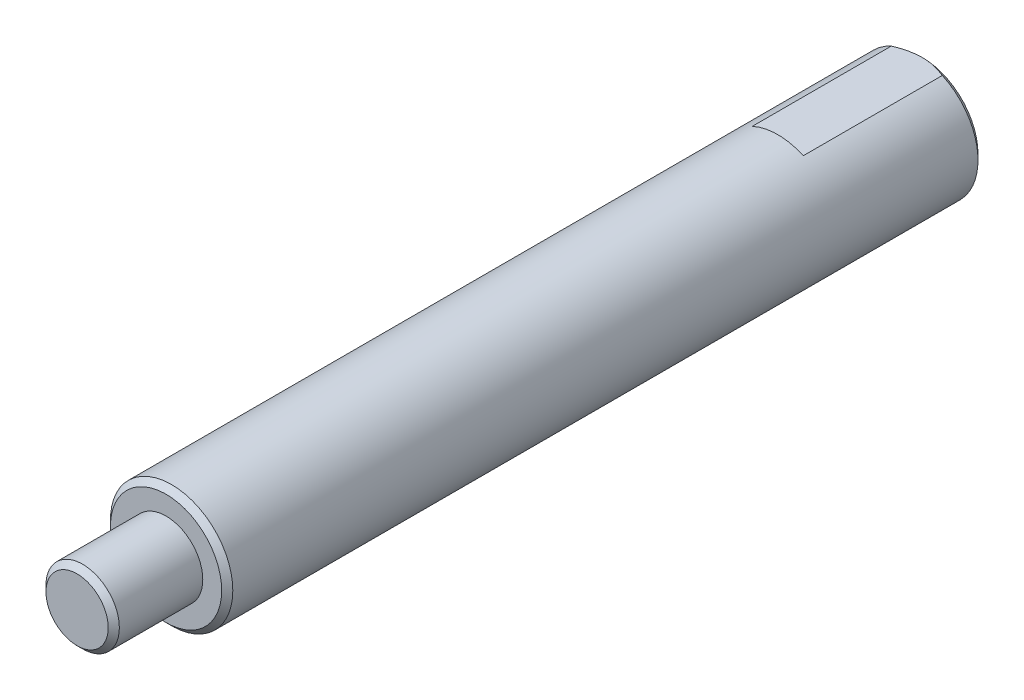
ISO-10303-21;
HEADER;
FILE_DESCRIPTION(('STEP AP214'),'2;1');
FILE_NAME('part.step','',(''),(''),'','','');
FILE_SCHEMA(('AUTOMOTIVE_DESIGN { 1 0 10303 214 1 1 1 1 }'));
ENDSEC;
DATA;
#1=APPLICATION_CONTEXT('core data for automotive mechanical design processes');
#2=APPLICATION_PROTOCOL_DEFINITION('international standard','automotive_design',2000,#1);
#3=PRODUCT_CONTEXT('',#1,'mechanical');
#4=PRODUCT('Part','Part','',(#3));
#5=PRODUCT_RELATED_PRODUCT_CATEGORY('part','',(#4));
#6=PRODUCT_DEFINITION_FORMATION('','',#4);
#7=PRODUCT_DEFINITION_CONTEXT('part definition',#1,'design');
#8=PRODUCT_DEFINITION('design','',#6,#7);
#9=PRODUCT_DEFINITION_SHAPE('','',#8);
#10=(LENGTH_UNIT() NAMED_UNIT(*) SI_UNIT(.MILLI.,.METRE.));
#11=(NAMED_UNIT(*) PLANE_ANGLE_UNIT() SI_UNIT($,.RADIAN.));
#12=(NAMED_UNIT(*) SI_UNIT($,.STERADIAN.) SOLID_ANGLE_UNIT());
#13=UNCERTAINTY_MEASURE_WITH_UNIT(LENGTH_MEASURE(1.E-05),#10,'distance_accuracy_value','');
#14=(GEOMETRIC_REPRESENTATION_CONTEXT(3) GLOBAL_UNCERTAINTY_ASSIGNED_CONTEXT((#13)) GLOBAL_UNIT_ASSIGNED_CONTEXT((#10,
#11,#12)) REPRESENTATION_CONTEXT('',''));
#15=CARTESIAN_POINT('',(0.,0.,0.));
#16=DIRECTION('',(0.,0.,1.));
#17=DIRECTION('',(1.,0.,0.));
#18=AXIS2_PLACEMENT_3D('',#15,#16,#17);
#19=CARTESIAN_POINT('',(0.,0.,0.5));
#20=DIRECTION('',(0.,0.,1.));
#21=DIRECTION('',(1.,0.,0.));
#22=AXIS2_PLACEMENT_3D('',#19,#20,#21);
#23=CONICAL_SURFACE('',#22,5.5,0.785398163397457);
#24=CARTESIAN_POINT('',(14.6848091307527,5.,10.5126921972504));
#25=CARTESIAN_POINT('',(14.4453208226169,5.,10.2859896541326));
#26=CARTESIAN_POINT('',(14.2055496886512,5.,10.0595855916861));
#27=CARTESIAN_POINT('',(13.7253433237667,5.,9.60748006149906));
#28=CARTESIAN_POINT('',(13.4849080888775,5.,9.38177859797622));
#29=CARTESIAN_POINT('',(12.7618962256916,5.,8.70536049882658));
#30=CARTESIAN_POINT('',(12.2781765081116,5.,8.25586410270802));
#31=CARTESIAN_POINT('',(11.285520275484,5.,7.34194274282295));
#32=CARTESIAN_POINT('',(10.7764003173808,5.,6.87771631839147));
#33=CARTESIAN_POINT('',(10.0081237078526,5.,6.18705169530893));
#34=CARTESIAN_POINT('',(9.75140731219676,5.,5.95789999795166));
#35=CARTESIAN_POINT('',(9.23598125315539,5.,5.50185127115898));
#36=CARTESIAN_POINT('',(8.97727160895973,5.,5.27495422006515));
#37=CARTESIAN_POINT('',(8.45777334373333,5.,4.82431921159364));
#38=CARTESIAN_POINT('',(8.19698831207968,5.,4.60057712329841));
#39=CARTESIAN_POINT('',(7.6723358301828,5.,4.15670009726197));
#40=CARTESIAN_POINT('',(7.4084682157494,5.,3.93656535317604));
#41=CARTESIAN_POINT('',(6.87588577364976,5.,3.50025684420232));
#42=CARTESIAN_POINT('',(6.60715699098736,5.,3.28410005066106));
#43=CARTESIAN_POINT('',(6.06467897085506,5.,2.85824880719012));
#44=CARTESIAN_POINT('',(5.79093054202075,5.,2.64855333071791));
#45=CARTESIAN_POINT('',(5.24247824545979,5.,2.24225256251792));
#46=CARTESIAN_POINT('',(4.96790940819435,5.,2.04546689887257));
#47=CARTESIAN_POINT('',(4.54965992503172,5.,1.7593740597509));
#48=CARTESIAN_POINT('',(4.40911425501469,5.,1.66548481679897));
#49=CARTESIAN_POINT('',(4.12560555295639,5.,1.48143277641831));
#50=CARTESIAN_POINT('',(3.98264266122826,5.,1.39126976373138));
#51=CARTESIAN_POINT('',(3.69483138879447,5.,1.21601413329321));
#52=CARTESIAN_POINT('',(3.54999993591857,5.,1.13089382459595));
#53=CARTESIAN_POINT('',(3.25720950323672,5.,0.96613475049896));
#54=CARTESIAN_POINT('',(3.10925012756169,5.,0.886496684424973));
#55=CARTESIAN_POINT('',(2.81011276522673,5.,0.734125373534712));
#56=CARTESIAN_POINT('',(2.65894061859038,5.,0.661380726321601));
#57=CARTESIAN_POINT('',(2.35286256329051,5.,0.524242686166179));
#58=CARTESIAN_POINT('',(2.19795788752428,5.,0.459846579258794));
#59=CARTESIAN_POINT('',(1.96757107505026,5.,0.372774300731281));
#60=CARTESIAN_POINT('',(1.89359074216658,5.,0.346101437024846));
#61=CARTESIAN_POINT('',(1.74478391072042,5.,0.295222264195086));
#62=CARTESIAN_POINT('',(1.66995737392907,5.,0.271016067006701));
#63=CARTESIAN_POINT('',(1.44419485912727,5.,0.202417832217193));
#64=CARTESIAN_POINT('',(1.29200049197909,5.,0.162055560028204));
#65=CARTESIAN_POINT('',(0.985646477349276,5.,0.0940487123556825));
#66=CARTESIAN_POINT('',(0.831502220582615,5.,0.0663354854095938));
#67=CARTESIAN_POINT('',(0.521341182896939,5.,0.0247588689838233));
#68=CARTESIAN_POINT('',(0.365324622092967,5.,0.0108938672889534));
#69=CARTESIAN_POINT('',(0.0516160098073081,5.,-0.00220571628048262));
#70=CARTESIAN_POINT('',(-0.106080254029489,5.,-0.00134130349865995));
#71=CARTESIAN_POINT('',(-0.420679844238093,5.,0.015205502727523));
#72=CARTESIAN_POINT('',(-0.577583163483296,5.,0.0308880291126693));
#73=CARTESIAN_POINT('',(-0.890071145811355,5.,0.0762385891218637));
#74=CARTESIAN_POINT('',(-1.04564624986807,5.,0.105971488681488));
#75=CARTESIAN_POINT('',(-1.35387421816574,5.,0.177884717281074));
#76=CARTESIAN_POINT('',(-1.50652647420601,5.,0.220067607636138));
#77=CARTESIAN_POINT('',(-1.89899228144063,5.,0.343556358459226));
#78=CARTESIAN_POINT('',(-2.13618939052799,5.,0.433155135839447));
#79=CARTESIAN_POINT('',(-2.6019239710927,5.,0.632544932175611));
#80=CARTESIAN_POINT('',(-2.83045405488705,5.,0.742352730382571));
#81=CARTESIAN_POINT('',(-3.16847602424751,5.,0.918609391765351));
#82=CARTESIAN_POINT('',(-3.2808721724946,5.,0.979600606049572));
#83=CARTESIAN_POINT('',(-3.50386518493618,5.,1.10479681410015));
#84=CARTESIAN_POINT('',(-3.61446202600304,5.,1.16900184913261));
#85=CARTESIAN_POINT('',(-3.83396126584146,5.,1.30012039469583));
#86=CARTESIAN_POINT('',(-3.94286443721393,5.,1.36703261693928));
#87=CARTESIAN_POINT('',(-4.15918024646913,5.,1.50320934076179));
#88=CARTESIAN_POINT('',(-4.26659294268127,5.,1.57247374992073));
#89=CARTESIAN_POINT('',(-4.62241235734337,5.,1.80671898738903));
#90=CARTESIAN_POINT('',(-4.8678658700884,5.,1.97619150842323));
#91=CARTESIAN_POINT('',(-5.35312692377588,5.,2.32306349681903));
#92=CARTESIAN_POINT('',(-5.5929332207239,5.,2.50046468625888));
#93=CARTESIAN_POINT('',(-6.06824445724728,5.,2.86127560728381));
#94=CARTESIAN_POINT('',(-6.30374612411163,5.,3.04468963665758));
#95=CARTESIAN_POINT('',(-6.77116765089348,5.,3.41597165684284));
#96=CARTESIAN_POINT('',(-7.00308779793956,5.,3.603839287518));
#97=CARTESIAN_POINT('',(-7.46479831203303,5.,3.98364854892032));
#98=CARTESIAN_POINT('',(-7.69457957218859,5.,4.17560122632358));
#99=CARTESIAN_POINT('',(-8.15180534086184,5.,4.56227258082269));
#100=CARTESIAN_POINT('',(-8.37924980937898,5.,4.7569913051315));
#101=CARTESIAN_POINT('',(-8.83212152767335,5.,5.14856830192789));
#102=CARTESIAN_POINT('',(-9.05754957794687,5.,5.34542564979244));
#103=CARTESIAN_POINT('',(-9.50680949169888,5.,5.74095449633208));
#104=CARTESIAN_POINT('',(-9.73064134364113,5.,5.93962600809511));
#105=CARTESIAN_POINT('',(-10.3554269609871,5.,6.49792304019967));
#106=CARTESIAN_POINT('',(-10.7548894567921,5.,6.85921712232008));
#107=CARTESIAN_POINT('',(-11.5506520435192,5.,7.58535654201278));
#108=CARTESIAN_POINT('',(-11.9469517546505,5.,7.95020229473568));
#109=CARTESIAN_POINT('',(-12.7346046209229,5.,8.6802168794551));
#110=CARTESIAN_POINT('',(-13.1259732089033,5.,9.04536907885113));
#111=CARTESIAN_POINT('',(-13.9067337252459,5.,9.77766414097997));
#112=CARTESIAN_POINT('',(-14.2961259422761,5.,10.1448066957958));
#113=CARTESIAN_POINT('',(-14.6848091307527,5.,10.5126921972504));
#114=B_SPLINE_CURVE_WITH_KNOTS('',3,(#24,#25,#26,#27,#28,#29,#30,#31,#32,#33,#34,#35,#36,#37,
#38,#39,#40,#41,#42,#43,#44,#45,#46,#47,#48,#49,#50,#51,#52,#53,#54,#55,#56,#57,#58,#59,#60,#61,
#62,#63,#64,#65,#66,#67,#68,#69,#70,#71,#72,#73,#74,#75,#76,#77,#78,#79,#80,#81,#82,#83,#84,#85,
#86,#87,#88,#89,#90,#91,#92,#93,#94,#95,#96,#97,#98,#99,#100,#101,#102,#103,#104,#105,#106,#107,
#108,#109,#110,#111,#112,#113),.UNSPECIFIED.,.F.,.F.,(4,2,2,2,2,2,2,2,2,2,2,2,2,2,2,2,2,2,2,2,2,
2,2,2,2,2,2,2,2,2,2,2,2,2,2,2,2,2,2,2,2,2,2,2,4),(0.,0.989311923310725,1.97862977419094,
3.95959337600449,6.02651317448664,7.05884240046679,8.09116170015323,9.12197286482435,
10.1528391870695,11.1873903696084,12.2217763312281,13.2349233326135,13.7419424161501,
14.2489321689687,14.7528143978999,15.2567607843972,15.7598584856993,16.2627922263957,
16.4986794127495,16.7345772986731,17.2064516788898,17.6757336299656,18.1449609407033,
18.6173431093421,19.0897295160002,19.5643184047905,20.0390049980712,20.798297788604,
21.5582238763949,21.9418160729224,22.325413196115,22.7088298733657,23.0922315031285,
23.9868071792125,24.8815781072262,25.7770031658052,26.6723560620085,27.5705534283766,
28.4687661443111,29.3666048627684,30.2644500636282,31.8802558929104,33.4962529155446,
35.1020309687601,36.707567313143),.UNSPECIFIED.);
#115=CARTESIAN_POINT('',(2.29128784747799,5.,0.499999999999981));
#116=VERTEX_POINT('',#115);
#117=CARTESIAN_POINT('',(0.,4.99999999999999,0.));
#118=VERTEX_POINT('',#117);
#119=EDGE_CURVE('E60',#116,#118,#114,.T.);
#120=ORIENTED_EDGE('',*,*,#119,.F.);
#121=CARTESIAN_POINT('',(0.,0.,0.5));
#122=DIRECTION('',(0.,0.,1.));
#123=DIRECTION('',(1.,0.,0.));
#124=AXIS2_PLACEMENT_3D('',#121,#122,#123);
#125=CIRCLE('',#124,5.5);
#126=CARTESIAN_POINT('',(2.29128784747792,-5.,0.5));
#127=VERTEX_POINT('',#126);
#128=EDGE_CURVE('E142',#127,#116,#125,.T.);
#129=ORIENTED_EDGE('',*,*,#128,.F.);
#130=CARTESIAN_POINT('',(-14.6848091307527,-5.,10.5126921972504));
#131=CARTESIAN_POINT('',(-14.4453208226169,-5.,10.2859896541325));
#132=CARTESIAN_POINT('',(-14.2055496886512,-5.,10.0595855916861));
#133=CARTESIAN_POINT('',(-13.7253433237667,-5.,9.60748006149906));
#134=CARTESIAN_POINT('',(-13.4849080888775,-5.,9.38177859797621));
#135=CARTESIAN_POINT('',(-12.7618962256916,-5.,8.70536049882658));
#136=CARTESIAN_POINT('',(-12.2781765081116,-5.,8.25586410270802));
#137=CARTESIAN_POINT('',(-11.285520275484,-5.,7.34194274282294));
#138=CARTESIAN_POINT('',(-10.7764003173808,-5.,6.87771631839147));
#139=CARTESIAN_POINT('',(-10.0081237078526,-5.,6.18705169530893));
#140=CARTESIAN_POINT('',(-9.75140731219676,-5.,5.95789999795166));
#141=CARTESIAN_POINT('',(-9.23598125315539,-5.,5.50185127115898));
#142=CARTESIAN_POINT('',(-8.97727160895972,-5.,5.27495422006515));
#143=CARTESIAN_POINT('',(-8.45777334373333,-5.,4.82431921159363));
#144=CARTESIAN_POINT('',(-8.19698831207968,-5.,4.60057712329841));
#145=CARTESIAN_POINT('',(-7.67233583018279,-5.,4.15670009726197));
#146=CARTESIAN_POINT('',(-7.4084682157494,-5.,3.93656535317604));
#147=CARTESIAN_POINT('',(-6.87588577364976,-5.,3.50025684420232));
#148=CARTESIAN_POINT('',(-6.60715699098736,-5.,3.28410005066106));
#149=CARTESIAN_POINT('',(-6.06467897085506,-5.,2.85824880719012));
#150=CARTESIAN_POINT('',(-5.79093054202075,-5.,2.64855333071791));
#151=CARTESIAN_POINT('',(-5.24247824545979,-5.,2.24225256251792));
#152=CARTESIAN_POINT('',(-4.96790940819436,-5.,2.04546689887257));
#153=CARTESIAN_POINT('',(-4.54965992503172,-5.,1.7593740597509));
#154=CARTESIAN_POINT('',(-4.40911425501469,-5.,1.66548481679897));
#155=CARTESIAN_POINT('',(-4.12560555295639,-5.,1.48143277641831));
#156=CARTESIAN_POINT('',(-3.98264266122826,-5.,1.39126976373138));
#157=CARTESIAN_POINT('',(-3.69483138879447,-5.,1.21601413329321));
#158=CARTESIAN_POINT('',(-3.54999993591857,-5.,1.13089382459595));
#159=CARTESIAN_POINT('',(-3.25720950323672,-5.,0.96613475049896));
#160=CARTESIAN_POINT('',(-3.10925012756169,-5.,0.886496684424973));
#161=CARTESIAN_POINT('',(-2.81011276522673,-5.,0.734125373534712));
#162=CARTESIAN_POINT('',(-2.65894061859038,-5.,0.661380726321601));
#163=CARTESIAN_POINT('',(-2.35286256329051,-5.,0.524242686166179));
#164=CARTESIAN_POINT('',(-2.19795788752428,-5.,0.459846579258795));
#165=CARTESIAN_POINT('',(-1.96757107505027,-5.,0.372774300731282));
#166=CARTESIAN_POINT('',(-1.89359074216658,-5.,0.346101437024846));
#167=CARTESIAN_POINT('',(-1.74478391072042,-5.,0.295222264195086));
#168=CARTESIAN_POINT('',(-1.66995737392907,-5.,0.271016067006701));
#169=CARTESIAN_POINT('',(-1.44419485912727,-5.,0.202417832217193));
#170=CARTESIAN_POINT('',(-1.29200049197909,-5.,0.162055560028204));
#171=CARTESIAN_POINT('',(-0.985646477349277,-5.,0.0940487123556828));
#172=CARTESIAN_POINT('',(-0.831502220582616,-5.,0.0663354854095948));
#173=CARTESIAN_POINT('',(-0.52134118289694,-5.,0.0247588689838242));
#174=CARTESIAN_POINT('',(-0.365324622092969,-5.,0.0108938672889537));
#175=CARTESIAN_POINT('',(-0.0516160098073107,-5.,-0.00220571628048288));
#176=CARTESIAN_POINT('',(0.106080254029486,-5.,-0.00134130349866004));
#177=CARTESIAN_POINT('',(0.42067984423809,-5.,0.0152055027275231));
#178=CARTESIAN_POINT('',(0.577583163483293,-5.,0.0308880291126695));
#179=CARTESIAN_POINT('',(0.890071145811352,-5.,0.0762385891218634));
#180=CARTESIAN_POINT('',(1.04564624986807,-5.,0.105971488681487));
#181=CARTESIAN_POINT('',(1.35387421816574,-5.,0.177884717281073));
#182=CARTESIAN_POINT('',(1.50652647420601,-5.,0.220067607636137));
#183=CARTESIAN_POINT('',(1.89899228144063,-5.,0.343556358459226));
#184=CARTESIAN_POINT('',(2.13618939052798,-5.,0.433155135839446));
#185=CARTESIAN_POINT('',(2.60192397109269,-5.,0.632544932175609));
#186=CARTESIAN_POINT('',(2.83045405488705,-5.,0.742352730382567));
#187=CARTESIAN_POINT('',(3.1684760242475,-5.,0.918609391765348));
#188=CARTESIAN_POINT('',(3.28087217249459,-5.,0.97960060604957));
#189=CARTESIAN_POINT('',(3.50386518493617,-5.,1.10479681410015));
#190=CARTESIAN_POINT('',(3.61446202600303,-5.,1.16900184913261));
#191=CARTESIAN_POINT('',(3.83396126584145,-5.,1.30012039469583));
#192=CARTESIAN_POINT('',(3.94286443721392,-5.,1.36703261693928));
#193=CARTESIAN_POINT('',(4.15918024646912,-5.,1.50320934076178));
#194=CARTESIAN_POINT('',(4.26659294268127,-5.,1.57247374992073));
#195=CARTESIAN_POINT('',(4.62241235734336,-5.,1.80671898738902));
#196=CARTESIAN_POINT('',(4.86786587008839,-5.,1.97619150842322));
#197=CARTESIAN_POINT('',(5.35312692377587,-5.,2.32306349681902));
#198=CARTESIAN_POINT('',(5.59293322072389,-5.,2.50046468625887));
#199=CARTESIAN_POINT('',(6.06824445724727,-5.,2.86127560728381));
#200=CARTESIAN_POINT('',(6.30374612411162,-5.,3.04468963665757));
#201=CARTESIAN_POINT('',(6.77116765089347,-5.,3.41597165684283));
#202=CARTESIAN_POINT('',(7.00308779793955,-5.,3.60383928751799));
#203=CARTESIAN_POINT('',(7.46479831203302,-5.,3.98364854892032));
#204=CARTESIAN_POINT('',(7.69457957218858,-5.,4.17560122632357));
#205=CARTESIAN_POINT('',(8.15180534086183,-5.,4.56227258082269));
#206=CARTESIAN_POINT('',(8.37924980937897,-5.,4.75699130513149));
#207=CARTESIAN_POINT('',(8.83212152767334,-5.,5.14856830192789));
#208=CARTESIAN_POINT('',(9.05754957794686,-5.,5.34542564979243));
#209=CARTESIAN_POINT('',(9.50680949169887,-5.,5.74095449633208));
#210=CARTESIAN_POINT('',(9.73064134364113,-5.,5.9396260080951));
#211=CARTESIAN_POINT('',(10.355426960987,-5.,6.49792304019967));
#212=CARTESIAN_POINT('',(10.7548894567921,-5.,6.85921712232007));
#213=CARTESIAN_POINT('',(11.5506520435192,-5.,7.58535654201278));
#214=CARTESIAN_POINT('',(11.9469517546505,-5.,7.95020229473567));
#215=CARTESIAN_POINT('',(12.7346046209229,-5.,8.6802168794551));
#216=CARTESIAN_POINT('',(13.1259732089033,-5.,9.04536907885113));
#217=CARTESIAN_POINT('',(13.9067337252459,-5.,9.77766414097997));
#218=CARTESIAN_POINT('',(14.2961259422761,-5.,10.1448066957958));
#219=CARTESIAN_POINT('',(14.6848091307527,-5.,10.5126921972504));
#220=B_SPLINE_CURVE_WITH_KNOTS('',3,(#130,#131,#132,#133,#134,#135,#136,#137,#138,#139,#140,
#141,#142,#143,#144,#145,#146,#147,#148,#149,#150,#151,#152,#153,#154,#155,#156,#157,#158,#159,
#160,#161,#162,#163,#164,#165,#166,#167,#168,#169,#170,#171,#172,#173,#174,#175,#176,#177,#178,
#179,#180,#181,#182,#183,#184,#185,#186,#187,#188,#189,#190,#191,#192,#193,#194,#195,#196,#197,
#198,#199,#200,#201,#202,#203,#204,#205,#206,#207,#208,#209,#210,#211,#212,#213,#214,#215,#216,
#217,#218,#219),.UNSPECIFIED.,.F.,.F.,(4,2,2,2,2,2,2,2,2,2,2,2,2,2,2,2,2,2,2,2,2,2,2,2,2,2,2,2,
2,2,2,2,2,2,2,2,2,2,2,2,2,2,2,2,4),(0.,0.989311923310724,1.97862977419094,3.95959337600449,
6.02651317448663,7.05884240046678,8.09116170015323,9.12197286482434,10.1528391870695,
11.1873903696084,12.2217763312281,13.2349233326135,13.7419424161501,14.2489321689687,
14.7528143978999,15.2567607843972,15.7598584856993,16.2627922263957,16.4986794127495,
16.7345772986731,17.2064516788898,17.6757336299656,18.1449609407033,18.6173431093421,
19.0897295160002,19.5643184047905,20.0390049980712,20.798297788604,21.5582238763948,
21.9418160729224,22.325413196115,22.7088298733657,23.0922315031285,23.9868071792125,
24.8815781072262,25.7770031658052,26.6723560620085,27.5705534283765,28.468766144311,
29.3666048627684,30.2644500636281,31.8802558929104,33.4962529155446,35.10203096876,
36.7075673131429),.UNSPECIFIED.);
#221=CARTESIAN_POINT('',(0.,-4.99999999999999,0.));
#222=VERTEX_POINT('',#221);
#223=EDGE_CURVE('E171',#222,#127,#220,.T.);
#224=ORIENTED_EDGE('',*,*,#223,.F.);
#225=CARTESIAN_POINT('',(0.,0.,0.));
#226=DIRECTION('',(0.,0.,1.));
#227=DIRECTION('',(1.,0.,0.));
#228=AXIS2_PLACEMENT_3D('',#225,#226,#227);
#229=CIRCLE('',#228,4.99999999999999);
#230=EDGE_CURVE('E151',#118,#222,#229,.F.);
#231=ORIENTED_EDGE('',*,*,#230,.F.);
#232=EDGE_LOOP('',(#120,#129,#224,#231));
#233=FACE_BOUND('',#232,.T.);
#234=ADVANCED_FACE('F44',(#233),#23,.T.);
#235=CARTESIAN_POINT('',(0.,0.,68.));
#236=DIRECTION('',(0.,0.,1.));
#237=DIRECTION('',(1.,0.,0.));
#238=AXIS2_PLACEMENT_3D('',#235,#236,#237);
#239=PLANE('',#238);
#240=CARTESIAN_POINT('',(0.,0.,68.));
#241=DIRECTION('',(0.,0.,1.));
#242=DIRECTION('',(1.,0.,0.));
#243=AXIS2_PLACEMENT_3D('',#240,#241,#242);
#244=CIRCLE('',#243,5.);
#245=CARTESIAN_POINT('',(5.,0.,68.));
#246=VERTEX_POINT('',#245);
#247=EDGE_CURVE('E150',#246,#246,#244,.T.);
#248=ORIENTED_EDGE('',*,*,#247,.T.);
#249=EDGE_LOOP('',(#248));
#250=FACE_BOUND('',#249,.T.);
#251=CARTESIAN_POINT('',(0.,0.,68.));
#252=DIRECTION('',(0.,0.,1.));
#253=DIRECTION('',(1.,0.,0.));
#254=AXIS2_PLACEMENT_3D('',#251,#252,#253);
#255=CIRCLE('',#254,3.3);
#256=CARTESIAN_POINT('',(3.3,0.,68.));
#257=VERTEX_POINT('',#256);
#258=EDGE_CURVE('E134',#257,#257,#255,.T.);
#259=ORIENTED_EDGE('',*,*,#258,.F.);
#260=EDGE_LOOP('',(#259));
#261=FACE_BOUND('',#260,.T.);
#262=ADVANCED_FACE('F213',(#250,#261),#239,.T.);
#263=CARTESIAN_POINT('',(0.,0.,68.));
#264=DIRECTION('',(0.,0.,-1.));
#265=DIRECTION('',(-1.,0.,0.));
#266=AXIS2_PLACEMENT_3D('',#263,#264,#265);
#267=CYLINDRICAL_SURFACE('',#266,5.5);
#268=CARTESIAN_POINT('',(0.,0.,13.));
#269=DIRECTION('',(0.,0.,-1.));
#270=DIRECTION('',(-1.,0.,0.));
#271=AXIS2_PLACEMENT_3D('',#268,#269,#270);
#272=CIRCLE('',#271,5.5);
#273=CARTESIAN_POINT('',(-2.29128784747792,5.,13.));
#274=VERTEX_POINT('',#273);
#275=CARTESIAN_POINT('',(2.29128784747792,5.,13.));
#276=VERTEX_POINT('',#275);
#277=EDGE_CURVE('E11',#274,#276,#272,.T.);
#278=ORIENTED_EDGE('',*,*,#277,.F.);
#279=DIRECTION('',(0.,0.,-1.));
#280=VECTOR('',#279,1.);
#281=CARTESIAN_POINT('',(-2.29128784747792,5.,68.));
#282=LINE('',#281,#280);
#283=CARTESIAN_POINT('',(-2.29128784747792,5.,0.5));
#284=VERTEX_POINT('',#283);
#285=EDGE_CURVE('E127',#274,#284,#282,.T.);
#286=ORIENTED_EDGE('',*,*,#285,.T.);
#287=CARTESIAN_POINT('',(-2.29128784747799,-5.,0.499999999999981));
#288=VERTEX_POINT('',#287);
#289=EDGE_CURVE('E113',#284,#288,#125,.T.);
#290=ORIENTED_EDGE('',*,*,#289,.T.);
#291=DIRECTION('',(0.,0.,-1.));
#292=VECTOR('',#291,1.);
#293=CARTESIAN_POINT('',(-2.29128784747792,-5.,68.));
#294=LINE('',#293,#292);
#295=CARTESIAN_POINT('',(-2.29128784747792,-5.,13.));
#296=VERTEX_POINT('',#295);
#297=EDGE_CURVE('E102',#288,#296,#294,.F.);
#298=ORIENTED_EDGE('',*,*,#297,.T.);
#299=CARTESIAN_POINT('',(0.,0.,13.));
#300=DIRECTION('',(0.,0.,1.));
#301=DIRECTION('',(1.,0.,0.));
#302=AXIS2_PLACEMENT_3D('',#299,#300,#301);
#303=CIRCLE('',#302,5.5);
#304=CARTESIAN_POINT('',(2.29128784747792,-5.,13.));
#305=VERTEX_POINT('',#304);
#306=EDGE_CURVE('E53',#296,#305,#303,.T.);
#307=ORIENTED_EDGE('',*,*,#306,.T.);
#308=DIRECTION('',(0.,0.,-1.));
#309=VECTOR('',#308,1.);
#310=CARTESIAN_POINT('',(2.29128784747792,-5.,68.));
#311=LINE('',#310,#309);
#312=EDGE_CURVE('E103',#305,#127,#311,.T.);
#313=ORIENTED_EDGE('',*,*,#312,.T.);
#314=ORIENTED_EDGE('',*,*,#128,.T.);
#315=DIRECTION('',(0.,0.,-1.));
#316=VECTOR('',#315,1.);
#317=CARTESIAN_POINT('',(2.29128784747792,5.,68.));
#318=LINE('',#317,#316);
#319=EDGE_CURVE('E119',#116,#276,#318,.F.);
#320=ORIENTED_EDGE('',*,*,#319,.T.);
#321=EDGE_LOOP('',(#278,#286,#290,#298,#307,#313,#314,#320));
#322=FACE_BOUND('',#321,.T.);
#323=CARTESIAN_POINT('',(0.,0.,67.5));
#324=DIRECTION('',(0.,0.,1.));
#325=DIRECTION('',(1.,0.,0.));
#326=AXIS2_PLACEMENT_3D('',#323,#324,#325);
#327=CIRCLE('',#326,5.5);
#328=CARTESIAN_POINT('',(5.5,0.,67.5));
#329=VERTEX_POINT('',#328);
#330=EDGE_CURVE('E138',#329,#329,#327,.F.);
#331=ORIENTED_EDGE('',*,*,#330,.T.);
#332=EDGE_LOOP('',(#331));
#333=FACE_BOUND('',#332,.T.);
#334=ADVANCED_FACE('F109',(#322,#333),#267,.T.);
#335=CARTESIAN_POINT('',(0.,0.,0.));
#336=DIRECTION('',(0.,0.,1.));
#337=DIRECTION('',(1.,0.,0.));
#338=AXIS2_PLACEMENT_3D('',#335,#336,#337);
#339=PLANE('',#338);
#340=CARTESIAN_POINT('',(0.,0.,0.));
#341=DIRECTION('',(0.,0.,1.));
#342=DIRECTION('',(1.,0.,0.));
#343=AXIS2_PLACEMENT_3D('',#340,#341,#342);
#344=CIRCLE('',#343,2.59999999999999);
#345=CARTESIAN_POINT('',(2.59999999999999,0.,0.));
#346=VERTEX_POINT('',#345);
#347=EDGE_CURVE('E167',#346,#346,#344,.T.);
#348=ORIENTED_EDGE('',*,*,#347,.T.);
#349=EDGE_LOOP('',(#348));
#350=FACE_BOUND('',#349,.T.);
#351=EDGE_CURVE('E146',#222,#118,#229,.F.);
#352=ORIENTED_EDGE('',*,*,#351,.T.);
#353=ORIENTED_EDGE('',*,*,#230,.T.);
#354=EDGE_LOOP('',(#352,#353));
#355=FACE_BOUND('',#354,.T.);
#356=ADVANCED_FACE('F217',(#350,#355),#339,.F.);
#357=EDGE_CURVE('E180',#118,#284,#114,.T.);
#358=ORIENTED_EDGE('',*,*,#357,.F.);
#359=ORIENTED_EDGE('',*,*,#351,.F.);
#360=EDGE_CURVE('E68',#288,#222,#220,.T.);
#361=ORIENTED_EDGE('',*,*,#360,.F.);
#362=ORIENTED_EDGE('',*,*,#289,.F.);
#363=EDGE_LOOP('',(#358,#359,#361,#362));
#364=FACE_BOUND('',#363,.T.);
#365=ADVANCED_FACE('F186',(#364),#23,.T.);
#366=CARTESIAN_POINT('',(0.,0.,68.));
#367=DIRECTION('',(0.,0.,-1.));
#368=DIRECTION('',(-1.,0.,0.));
#369=AXIS2_PLACEMENT_3D('',#366,#367,#368);
#370=CONICAL_SURFACE('',#369,5.,0.785398163397457);
#371=ORIENTED_EDGE('',*,*,#330,.F.);
#372=EDGE_LOOP('',(#371));
#373=FACE_BOUND('',#372,.T.);
#374=ORIENTED_EDGE('',*,*,#247,.F.);
#375=EDGE_LOOP('',(#374));
#376=FACE_BOUND('',#375,.T.);
#377=ADVANCED_FACE('F211',(#373,#376),#370,.T.);
#378=CARTESIAN_POINT('',(0.,0.,76.));
#379=DIRECTION('',(0.,0.,-1.));
#380=DIRECTION('',(-1.,0.,0.));
#381=AXIS2_PLACEMENT_3D('',#378,#379,#380);
#382=CYLINDRICAL_SURFACE('',#381,3.3);
#383=CARTESIAN_POINT('',(0.,0.,75.5));
#384=DIRECTION('',(0.,0.,1.));
#385=DIRECTION('',(1.,0.,0.));
#386=AXIS2_PLACEMENT_3D('',#383,#384,#385);
#387=CIRCLE('',#386,3.3);
#388=CARTESIAN_POINT('',(3.3,0.,75.5));
#389=VERTEX_POINT('',#388);
#390=EDGE_CURVE('E159',#389,#389,#387,.F.);
#391=ORIENTED_EDGE('',*,*,#390,.T.);
#392=EDGE_LOOP('',(#391));
#393=FACE_BOUND('',#392,.T.);
#394=ORIENTED_EDGE('',*,*,#258,.T.);
#395=EDGE_LOOP('',(#394));
#396=FACE_BOUND('',#395,.T.);
#397=ADVANCED_FACE('F207',(#393,#396),#382,.T.);
#398=CARTESIAN_POINT('',(0.,0.,76.));
#399=DIRECTION('',(0.,0.,1.));
#400=DIRECTION('',(1.,0.,0.));
#401=AXIS2_PLACEMENT_3D('',#398,#399,#400);
#402=PLANE('',#401);
#403=CARTESIAN_POINT('',(0.,0.,76.));
#404=DIRECTION('',(0.,0.,1.));
#405=DIRECTION('',(1.,0.,0.));
#406=AXIS2_PLACEMENT_3D('',#403,#404,#405);
#407=CIRCLE('',#406,2.80000000000001);
#408=CARTESIAN_POINT('',(2.80000000000001,0.,76.));
#409=VERTEX_POINT('',#408);
#410=EDGE_CURVE('E155',#409,#409,#407,.T.);
#411=ORIENTED_EDGE('',*,*,#410,.T.);
#412=EDGE_LOOP('',(#411));
#413=FACE_BOUND('',#412,.T.);
#414=ADVANCED_FACE('F204',(#413),#402,.T.);
#415=CARTESIAN_POINT('',(0.,0.,76.));
#416=DIRECTION('',(0.,0.,-1.));
#417=DIRECTION('',(-1.,0.,0.));
#418=AXIS2_PLACEMENT_3D('',#415,#416,#417);
#419=CONICAL_SURFACE('',#418,2.80000000000001,0.785398163397451);
#420=ORIENTED_EDGE('',*,*,#390,.F.);
#421=EDGE_LOOP('',(#420));
#422=FACE_BOUND('',#421,.T.);
#423=ORIENTED_EDGE('',*,*,#410,.F.);
#424=EDGE_LOOP('',(#423));
#425=FACE_BOUND('',#424,.T.);
#426=ADVANCED_FACE('F202',(#422,#425),#419,.T.);
#427=CARTESIAN_POINT('',(0.,0.,12.4));
#428=DIRECTION('',(0.,0.,-1.));
#429=DIRECTION('',(-1.,0.,0.));
#430=AXIS2_PLACEMENT_3D('',#427,#428,#429);
#431=CONICAL_SURFACE('',#430,2.1,1.02974425867665);
#432=CARTESIAN_POINT('',(0.,0.,13.6618072999579));
#433=VERTEX_POINT('',#432);
#434=VERTEX_LOOP('',#433);
#435=FACE_BOUND('',#434,.T.);
#436=CARTESIAN_POINT('',(0.,0.,12.4));
#437=DIRECTION('',(0.,0.,-1.));
#438=DIRECTION('',(-1.,0.,0.));
#439=AXIS2_PLACEMENT_3D('',#436,#437,#438);
#440=CIRCLE('',#439,2.1);
#441=CARTESIAN_POINT('',(-2.1,0.,12.4));
#442=VERTEX_POINT('',#441);
#443=EDGE_CURVE('E130',#442,#442,#440,.T.);
#444=ORIENTED_EDGE('',*,*,#443,.T.);
#445=EDGE_LOOP('',(#444));
#446=FACE_BOUND('',#445,.T.);
#447=ADVANCED_FACE('F198',(#435,#446),#431,.F.);
#448=CARTESIAN_POINT('',(0.,0.,0.));
#449=DIRECTION('',(0.,0.,-1.));
#450=DIRECTION('',(-1.,0.,0.));
#451=AXIS2_PLACEMENT_3D('',#448,#449,#450);
#452=CYLINDRICAL_SURFACE('',#451,2.1);
#453=CARTESIAN_POINT('',(0.,0.,0.499999999999993));
#454=DIRECTION('',(0.,0.,1.));
#455=DIRECTION('',(1.,0.,0.));
#456=AXIS2_PLACEMENT_3D('',#453,#454,#455);
#457=CIRCLE('',#456,2.1);
#458=CARTESIAN_POINT('',(2.1,0.,0.499999999999993));
#459=VERTEX_POINT('',#458);
#460=EDGE_CURVE('E163',#459,#459,#457,.F.);
#461=ORIENTED_EDGE('',*,*,#460,.T.);
#462=EDGE_LOOP('',(#461));
#463=FACE_BOUND('',#462,.T.);
#464=ORIENTED_EDGE('',*,*,#443,.F.);
#465=EDGE_LOOP('',(#464));
#466=FACE_BOUND('',#465,.T.);
#467=ADVANCED_FACE('F195',(#463,#466),#452,.F.);
#468=CARTESIAN_POINT('',(0.,0.,0.499999999999993));
#469=DIRECTION('',(0.,0.,-1.));
#470=DIRECTION('',(-1.,0.,0.));
#471=AXIS2_PLACEMENT_3D('',#468,#469,#470);
#472=CONICAL_SURFACE('',#471,2.1,0.785398163397448);
#473=ORIENTED_EDGE('',*,*,#347,.F.);
#474=EDGE_LOOP('',(#473));
#475=FACE_BOUND('',#474,.T.);
#476=ORIENTED_EDGE('',*,*,#460,.F.);
#477=EDGE_LOOP('',(#476));
#478=FACE_BOUND('',#477,.T.);
#479=ADVANCED_FACE('F46',(#475,#478),#472,.F.);
#480=CARTESIAN_POINT('',(0.,0.,13.));
#481=DIRECTION('',(0.,0.,1.));
#482=DIRECTION('',(1.,0.,0.));
#483=AXIS2_PLACEMENT_3D('',#480,#481,#482);
#484=PLANE('',#483);
#485=DIRECTION('',(1.,0.,0.));
#486=VECTOR('',#485,1.);
#487=CARTESIAN_POINT('',(5.,-5.,13.));
#488=LINE('',#487,#486);
#489=EDGE_CURVE('E96',#296,#305,#488,.T.);
#490=ORIENTED_EDGE('',*,*,#489,.T.);
#491=ORIENTED_EDGE('',*,*,#306,.F.);
#492=EDGE_LOOP('',(#490,#491));
#493=FACE_BOUND('',#492,.T.);
#494=ADVANCED_FACE('F95',(#493),#484,.F.);
#495=CARTESIAN_POINT('',(5.,-5.,13.));
#496=DIRECTION('',(0.,1.,0.));
#497=DIRECTION('',(0.,0.,1.));
#498=AXIS2_PLACEMENT_3D('',#495,#496,#497);
#499=PLANE('',#498);
#500=ORIENTED_EDGE('',*,*,#489,.F.);
#501=ORIENTED_EDGE('',*,*,#297,.F.);
#502=ORIENTED_EDGE('',*,*,#360,.T.);
#503=ORIENTED_EDGE('',*,*,#223,.T.);
#504=ORIENTED_EDGE('',*,*,#312,.F.);
#505=EDGE_LOOP('',(#500,#501,#502,#503,#504));
#506=FACE_BOUND('',#505,.T.);
#507=ADVANCED_FACE('F101',(#506),#499,.F.);
#508=CARTESIAN_POINT('',(0.,0.,13.));
#509=DIRECTION('',(0.,0.,-1.));
#510=DIRECTION('',(-1.,0.,0.));
#511=AXIS2_PLACEMENT_3D('',#508,#509,#510);
#512=PLANE('',#511);
#513=ORIENTED_EDGE('',*,*,#277,.T.);
#514=DIRECTION('',(-1.,0.,0.));
#515=VECTOR('',#514,1.);
#516=CARTESIAN_POINT('',(5.,5.,13.));
#517=LINE('',#516,#515);
#518=EDGE_CURVE('E105',#276,#274,#517,.T.);
#519=ORIENTED_EDGE('',*,*,#518,.T.);
#520=EDGE_LOOP('',(#513,#519));
#521=FACE_BOUND('',#520,.T.);
#522=ADVANCED_FACE('F194',(#521),#512,.T.);
#523=CARTESIAN_POINT('',(5.,5.,13.));
#524=DIRECTION('',(0.,-1.,0.));
#525=DIRECTION('',(0.,0.,-1.));
#526=AXIS2_PLACEMENT_3D('',#523,#524,#525);
#527=PLANE('',#526);
#528=ORIENTED_EDGE('',*,*,#518,.F.);
#529=ORIENTED_EDGE('',*,*,#319,.F.);
#530=ORIENTED_EDGE('',*,*,#119,.T.);
#531=ORIENTED_EDGE('',*,*,#357,.T.);
#532=ORIENTED_EDGE('',*,*,#285,.F.);
#533=EDGE_LOOP('',(#528,#529,#530,#531,#532));
#534=FACE_BOUND('',#533,.T.);
#535=ADVANCED_FACE('F265',(#534),#527,.F.);
#536=CLOSED_SHELL('',(#234,#262,#334,#356,#365,#377,#397,#414,#426,#447,#467,#479,#494,#507,
#522,#535));
#537=MANIFOLD_SOLID_BREP('B2',#536);
#538=ADVANCED_BREP_SHAPE_REPRESENTATION('',(#18,#537),#14);
#539=SHAPE_DEFINITION_REPRESENTATION(#9,#538);
ENDSEC;
END-ISO-10303-21;
